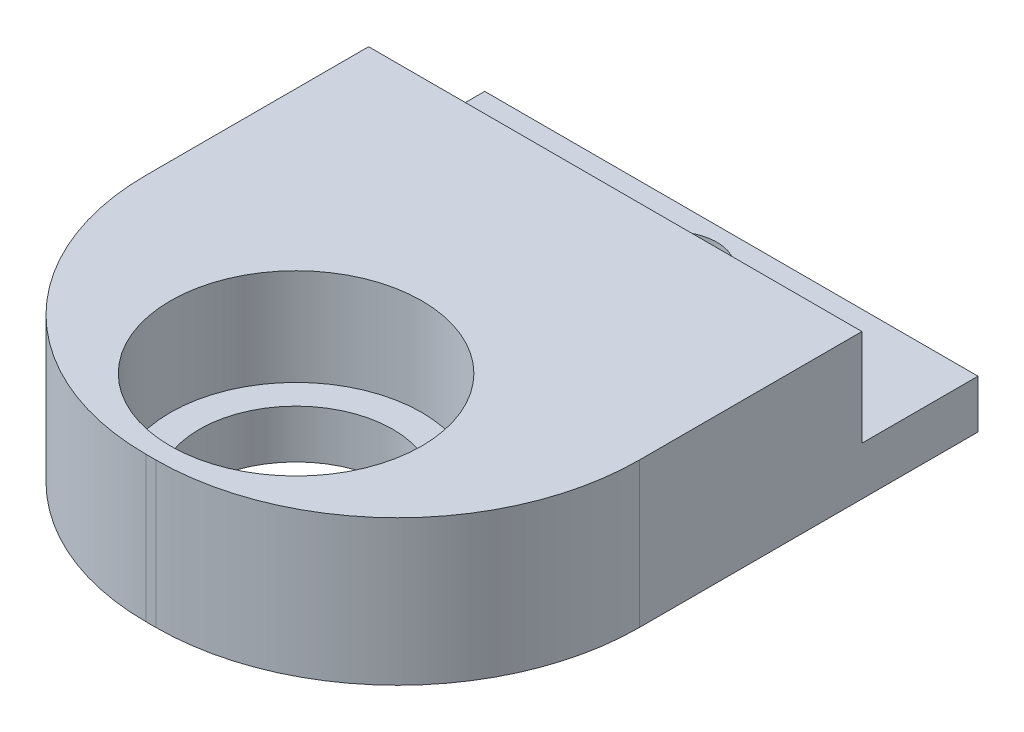
ISO-10303-21;
HEADER;
FILE_DESCRIPTION(('STEP AP214'),'2;1');
FILE_NAME('part.step','',(''),(''),'','','');
FILE_SCHEMA(('AUTOMOTIVE_DESIGN { 1 0 10303 214 1 1 1 1 }'));
ENDSEC;
DATA;
#1=APPLICATION_CONTEXT('core data for automotive mechanical design processes');
#2=APPLICATION_PROTOCOL_DEFINITION('international standard','automotive_design',2000,#1);
#3=PRODUCT_CONTEXT('',#1,'mechanical');
#4=PRODUCT('Part','Part','',(#3));
#5=PRODUCT_RELATED_PRODUCT_CATEGORY('part','',(#4));
#6=PRODUCT_DEFINITION_FORMATION('','',#4);
#7=PRODUCT_DEFINITION_CONTEXT('part definition',#1,'design');
#8=PRODUCT_DEFINITION('design','',#6,#7);
#9=PRODUCT_DEFINITION_SHAPE('','',#8);
#10=(LENGTH_UNIT() NAMED_UNIT(*) SI_UNIT(.MILLI.,.METRE.));
#11=(NAMED_UNIT(*) PLANE_ANGLE_UNIT() SI_UNIT($,.RADIAN.));
#12=(NAMED_UNIT(*) SI_UNIT($,.STERADIAN.) SOLID_ANGLE_UNIT());
#13=UNCERTAINTY_MEASURE_WITH_UNIT(LENGTH_MEASURE(1.E-05),#10,'distance_accuracy_value','');
#14=(GEOMETRIC_REPRESENTATION_CONTEXT(3) GLOBAL_UNCERTAINTY_ASSIGNED_CONTEXT((#13)) GLOBAL_UNIT_ASSIGNED_CONTEXT((#10,
#11,#12)) REPRESENTATION_CONTEXT('',''));
#15=CARTESIAN_POINT('',(0.,0.,0.));
#16=DIRECTION('',(0.,0.,1.));
#17=DIRECTION('',(1.,0.,0.));
#18=AXIS2_PLACEMENT_3D('',#15,#16,#17);
#19=CARTESIAN_POINT('',(0.,5.,0.));
#20=DIRECTION('',(0.,1.,0.));
#21=DIRECTION('',(0.,0.,1.));
#22=AXIS2_PLACEMENT_3D('',#19,#20,#21);
#23=PLANE('',#22);
#24=CARTESIAN_POINT('',(0.,5.,-24.));
#25=DIRECTION('',(0.,1.,0.));
#26=DIRECTION('',(0.,0.,1.));
#27=AXIS2_PLACEMENT_3D('',#24,#25,#26);
#28=CIRCLE('',#27,4.5);
#29=CARTESIAN_POINT('',(0.,5.,-19.5));
#30=VERTEX_POINT('',#29);
#31=EDGE_CURVE('E160',#30,#30,#28,.T.);
#32=ORIENTED_EDGE('',*,*,#31,.F.);
#33=EDGE_LOOP('',(#32));
#34=FACE_BOUND('',#33,.T.);
#35=DIRECTION('',(0.,0.,1.));
#36=VECTOR('',#35,1.);
#37=CARTESIAN_POINT('',(-25.5,5.,30.));
#38=LINE('',#37,#36);
#39=CARTESIAN_POINT('',(-25.5,5.,-30.));
#40=VERTEX_POINT('',#39);
#41=CARTESIAN_POINT('',(-25.5,5.,-18.));
#42=VERTEX_POINT('',#41);
#43=EDGE_CURVE('E168',#40,#42,#38,.T.);
#44=ORIENTED_EDGE('',*,*,#43,.T.);
#45=DIRECTION('',(1.,0.,0.));
#46=VECTOR('',#45,1.);
#47=CARTESIAN_POINT('',(0.,5.,-18.));
#48=LINE('',#47,#46);
#49=CARTESIAN_POINT('',(25.5,5.,-18.));
#50=VERTEX_POINT('',#49);
#51=EDGE_CURVE('E128',#42,#50,#48,.T.);
#52=ORIENTED_EDGE('',*,*,#51,.T.);
#53=DIRECTION('',(0.,0.,-1.));
#54=VECTOR('',#53,1.);
#55=CARTESIAN_POINT('',(25.5,5.,30.));
#56=LINE('',#55,#54);
#57=CARTESIAN_POINT('',(25.5,5.,-30.));
#58=VERTEX_POINT('',#57);
#59=EDGE_CURVE('E171',#50,#58,#56,.T.);
#60=ORIENTED_EDGE('',*,*,#59,.T.);
#61=DIRECTION('',(-1.,0.,0.));
#62=VECTOR('',#61,1.);
#63=CARTESIAN_POINT('',(25.5,5.,-30.));
#64=LINE('',#63,#62);
#65=EDGE_CURVE('E175',#58,#40,#64,.T.);
#66=ORIENTED_EDGE('',*,*,#65,.T.);
#67=EDGE_LOOP('',(#44,#52,#60,#66));
#68=FACE_BOUND('',#67,.T.);
#69=ADVANCED_FACE('F49',(#34,#68),#23,.T.);
#70=CARTESIAN_POINT('',(0.,5.,15.));
#71=DIRECTION('',(0.,1.,0.));
#72=DIRECTION('',(0.,0.,1.));
#73=AXIS2_PLACEMENT_3D('',#70,#71,#72);
#74=CIRCLE('',#73,10.);
#75=CARTESIAN_POINT('',(0.,5.,25.));
#76=VERTEX_POINT('',#75);
#77=EDGE_CURVE('E152',#76,#76,#74,.T.);
#78=ORIENTED_EDGE('',*,*,#77,.F.);
#79=EDGE_LOOP('',(#78));
#80=FACE_BOUND('',#79,.T.);
#81=CARTESIAN_POINT('',(0.,5.,15.));
#82=DIRECTION('',(0.,1.,0.));
#83=DIRECTION('',(0.,0.,1.));
#84=AXIS2_PLACEMENT_3D('',#81,#82,#83);
#85=CIRCLE('',#84,13.);
#86=CARTESIAN_POINT('',(0.,5.,28.));
#87=VERTEX_POINT('',#86);
#88=EDGE_CURVE('E288',#87,#87,#85,.T.);
#89=ORIENTED_EDGE('',*,*,#88,.T.);
#90=EDGE_LOOP('',(#89));
#91=FACE_BOUND('',#90,.T.);
#92=ADVANCED_FACE('F241',(#80,#91),#23,.T.);
#93=CARTESIAN_POINT('',(0.,0.,0.));
#94=DIRECTION('',(0.,1.,0.));
#95=DIRECTION('',(0.,0.,1.));
#96=AXIS2_PLACEMENT_3D('',#93,#94,#95);
#97=PLANE('',#96);
#98=DIRECTION('',(0.,0.,-1.));
#99=VECTOR('',#98,1.);
#100=CARTESIAN_POINT('',(25.5,0.,30.));
#101=LINE('',#100,#99);
#102=CARTESIAN_POINT('',(25.5,0.,5.));
#103=VERTEX_POINT('',#102);
#104=CARTESIAN_POINT('',(25.5,0.,-30.));
#105=VERTEX_POINT('',#104);
#106=EDGE_CURVE('E184',#103,#105,#101,.T.);
#107=ORIENTED_EDGE('',*,*,#106,.F.);
#108=CARTESIAN_POINT('',(0.5,0.,5.));
#109=DIRECTION('',(0.,1.,0.));
#110=DIRECTION('',(0.,0.,1.));
#111=AXIS2_PLACEMENT_3D('',#108,#109,#110);
#112=CIRCLE('',#111,25.);
#113=CARTESIAN_POINT('',(0.500000000000004,0.,30.));
#114=VERTEX_POINT('',#113);
#115=EDGE_CURVE('E202',#103,#114,#112,.F.);
#116=ORIENTED_EDGE('',*,*,#115,.T.);
#117=DIRECTION('',(1.,0.,0.));
#118=VECTOR('',#117,1.);
#119=CARTESIAN_POINT('',(25.5,0.,30.));
#120=LINE('',#119,#118);
#121=CARTESIAN_POINT('',(-0.49999999999999,0.,30.));
#122=VERTEX_POINT('',#121);
#123=EDGE_CURVE('E180',#122,#114,#120,.T.);
#124=ORIENTED_EDGE('',*,*,#123,.F.);
#125=CARTESIAN_POINT('',(-0.499999999999994,0.,5.));
#126=DIRECTION('',(0.,1.,0.));
#127=DIRECTION('',(0.,0.,1.));
#128=AXIS2_PLACEMENT_3D('',#125,#126,#127);
#129=CIRCLE('',#128,25.);
#130=CARTESIAN_POINT('',(-25.5,0.,5.));
#131=VERTEX_POINT('',#130);
#132=EDGE_CURVE('E199',#122,#131,#129,.F.);
#133=ORIENTED_EDGE('',*,*,#132,.T.);
#134=DIRECTION('',(0.,0.,1.));
#135=VECTOR('',#134,1.);
#136=CARTESIAN_POINT('',(-25.5,0.,30.));
#137=LINE('',#136,#135);
#138=CARTESIAN_POINT('',(-25.5,0.,-30.));
#139=VERTEX_POINT('',#138);
#140=EDGE_CURVE('E164',#139,#131,#137,.T.);
#141=ORIENTED_EDGE('',*,*,#140,.F.);
#142=DIRECTION('',(-1.,0.,0.));
#143=VECTOR('',#142,1.);
#144=CARTESIAN_POINT('',(25.5,0.,-30.));
#145=LINE('',#144,#143);
#146=EDGE_CURVE('E172',#105,#139,#145,.T.);
#147=ORIENTED_EDGE('',*,*,#146,.F.);
#148=EDGE_LOOP('',(#107,#116,#124,#133,#141,#147));
#149=FACE_BOUND('',#148,.T.);
#150=CARTESIAN_POINT('',(0.,0.,-24.));
#151=DIRECTION('',(0.,1.,0.));
#152=DIRECTION('',(0.,0.,1.));
#153=AXIS2_PLACEMENT_3D('',#150,#151,#152);
#154=CIRCLE('',#153,4.5);
#155=CARTESIAN_POINT('',(0.,0.,-19.5));
#156=VERTEX_POINT('',#155);
#157=EDGE_CURVE('E156',#156,#156,#154,.T.);
#158=ORIENTED_EDGE('',*,*,#157,.T.);
#159=EDGE_LOOP('',(#158));
#160=FACE_BOUND('',#159,.T.);
#161=CARTESIAN_POINT('',(0.,0.,15.));
#162=DIRECTION('',(0.,1.,0.));
#163=DIRECTION('',(0.,0.,1.));
#164=AXIS2_PLACEMENT_3D('',#161,#162,#163);
#165=CIRCLE('',#164,10.);
#166=CARTESIAN_POINT('',(0.,0.,25.));
#167=VERTEX_POINT('',#166);
#168=EDGE_CURVE('E150',#167,#167,#165,.T.);
#169=ORIENTED_EDGE('',*,*,#168,.T.);
#170=EDGE_LOOP('',(#169));
#171=FACE_BOUND('',#170,.T.);
#172=ADVANCED_FACE('F226',(#149,#160,#171),#97,.F.);
#173=CARTESIAN_POINT('',(-25.5,5.,30.));
#174=DIRECTION('',(1.,0.,0.));
#175=DIRECTION('',(0.,0.,-1.));
#176=AXIS2_PLACEMENT_3D('',#173,#174,#175);
#177=PLANE('',#176);
#178=ORIENTED_EDGE('',*,*,#140,.T.);
#179=DIRECTION('',(0.,-1.,0.));
#180=VECTOR('',#179,1.);
#181=CARTESIAN_POINT('',(-25.5,5.,5.));
#182=LINE('',#181,#180);
#183=CARTESIAN_POINT('',(-25.5,15.,5.));
#184=VERTEX_POINT('',#183);
#185=EDGE_CURVE('E11',#131,#184,#182,.F.);
#186=ORIENTED_EDGE('',*,*,#185,.T.);
#187=DIRECTION('',(0.,0.,-1.));
#188=VECTOR('',#187,1.);
#189=CARTESIAN_POINT('',(-25.5,15.,0.));
#190=LINE('',#189,#188);
#191=CARTESIAN_POINT('',(-25.5,15.,-18.));
#192=VERTEX_POINT('',#191);
#193=EDGE_CURVE('E112',#184,#192,#190,.T.);
#194=ORIENTED_EDGE('',*,*,#193,.T.);
#195=DIRECTION('',(0.,-1.,0.));
#196=VECTOR('',#195,1.);
#197=CARTESIAN_POINT('',(-25.5,15.,-18.));
#198=LINE('',#197,#196);
#199=EDGE_CURVE('E116',#192,#42,#198,.T.);
#200=ORIENTED_EDGE('',*,*,#199,.T.);
#201=ORIENTED_EDGE('',*,*,#43,.F.);
#202=DIRECTION('',(0.,-1.,0.));
#203=VECTOR('',#202,1.);
#204=CARTESIAN_POINT('',(-25.5,5.,-30.));
#205=LINE('',#204,#203);
#206=EDGE_CURVE('E178',#40,#139,#205,.T.);
#207=ORIENTED_EDGE('',*,*,#206,.T.);
#208=EDGE_LOOP('',(#178,#186,#194,#200,#201,#207));
#209=FACE_BOUND('',#208,.T.);
#210=ADVANCED_FACE('F114',(#209),#177,.F.);
#211=CARTESIAN_POINT('',(25.5,5.,30.));
#212=DIRECTION('',(0.,0.,-1.));
#213=DIRECTION('',(-1.,0.,0.));
#214=AXIS2_PLACEMENT_3D('',#211,#212,#213);
#215=PLANE('',#214);
#216=ORIENTED_EDGE('',*,*,#123,.T.);
#217=DIRECTION('',(0.,-1.,0.));
#218=VECTOR('',#217,1.);
#219=CARTESIAN_POINT('',(0.500000000000004,5.,30.));
#220=LINE('',#219,#218);
#221=CARTESIAN_POINT('',(0.500000000000004,15.,30.));
#222=VERTEX_POINT('',#221);
#223=EDGE_CURVE('E209',#114,#222,#220,.F.);
#224=ORIENTED_EDGE('',*,*,#223,.T.);
#225=DIRECTION('',(-1.,0.,0.));
#226=VECTOR('',#225,1.);
#227=CARTESIAN_POINT('',(0.,15.,30.));
#228=LINE('',#227,#226);
#229=CARTESIAN_POINT('',(-0.49999999999999,15.,30.));
#230=VERTEX_POINT('',#229);
#231=EDGE_CURVE('E121',#222,#230,#228,.T.);
#232=ORIENTED_EDGE('',*,*,#231,.T.);
#233=DIRECTION('',(0.,-1.,0.));
#234=VECTOR('',#233,1.);
#235=CARTESIAN_POINT('',(-0.49999999999999,5.,30.));
#236=LINE('',#235,#234);
#237=EDGE_CURVE('E205',#230,#122,#236,.T.);
#238=ORIENTED_EDGE('',*,*,#237,.T.);
#239=EDGE_LOOP('',(#216,#224,#232,#238));
#240=FACE_BOUND('',#239,.T.);
#241=ADVANCED_FACE('F230',(#240),#215,.F.);
#242=CARTESIAN_POINT('',(25.5,5.,30.));
#243=DIRECTION('',(-1.,0.,0.));
#244=DIRECTION('',(0.,0.,1.));
#245=AXIS2_PLACEMENT_3D('',#242,#243,#244);
#246=PLANE('',#245);
#247=DIRECTION('',(0.,0.,1.));
#248=VECTOR('',#247,1.);
#249=CARTESIAN_POINT('',(25.5,15.,0.));
#250=LINE('',#249,#248);
#251=CARTESIAN_POINT('',(25.5,15.,-18.));
#252=VERTEX_POINT('',#251);
#253=CARTESIAN_POINT('',(25.5,15.,5.));
#254=VERTEX_POINT('',#253);
#255=EDGE_CURVE('E132',#252,#254,#250,.T.);
#256=ORIENTED_EDGE('',*,*,#255,.T.);
#257=DIRECTION('',(0.,-1.,0.));
#258=VECTOR('',#257,1.);
#259=CARTESIAN_POINT('',(25.5,5.,5.));
#260=LINE('',#259,#258);
#261=EDGE_CURVE('E195',#254,#103,#260,.T.);
#262=ORIENTED_EDGE('',*,*,#261,.T.);
#263=ORIENTED_EDGE('',*,*,#106,.T.);
#264=DIRECTION('',(0.,-1.,0.));
#265=VECTOR('',#264,1.);
#266=CARTESIAN_POINT('',(25.5,5.,-30.));
#267=LINE('',#266,#265);
#268=EDGE_CURVE('E191',#58,#105,#267,.T.);
#269=ORIENTED_EDGE('',*,*,#268,.F.);
#270=ORIENTED_EDGE('',*,*,#59,.F.);
#271=DIRECTION('',(0.,-1.,0.));
#272=VECTOR('',#271,1.);
#273=CARTESIAN_POINT('',(25.5,15.,-18.));
#274=LINE('',#273,#272);
#275=EDGE_CURVE('E131',#252,#50,#274,.T.);
#276=ORIENTED_EDGE('',*,*,#275,.F.);
#277=EDGE_LOOP('',(#256,#262,#263,#269,#270,#276));
#278=FACE_BOUND('',#277,.T.);
#279=ADVANCED_FACE('F220',(#278),#246,.F.);
#280=CARTESIAN_POINT('',(25.5,5.,-30.));
#281=DIRECTION('',(0.,0.,1.));
#282=DIRECTION('',(1.,0.,0.));
#283=AXIS2_PLACEMENT_3D('',#280,#281,#282);
#284=PLANE('',#283);
#285=ORIENTED_EDGE('',*,*,#146,.T.);
#286=ORIENTED_EDGE('',*,*,#206,.F.);
#287=ORIENTED_EDGE('',*,*,#65,.F.);
#288=ORIENTED_EDGE('',*,*,#268,.T.);
#289=EDGE_LOOP('',(#285,#286,#287,#288));
#290=FACE_BOUND('',#289,.T.);
#291=ADVANCED_FACE('F237',(#290),#284,.F.);
#292=CARTESIAN_POINT('',(0.,5.,-24.));
#293=DIRECTION('',(0.,-1.,0.));
#294=DIRECTION('',(0.,0.,-1.));
#295=AXIS2_PLACEMENT_3D('',#292,#293,#294);
#296=CYLINDRICAL_SURFACE('',#295,4.5);
#297=ORIENTED_EDGE('',*,*,#31,.T.);
#298=EDGE_LOOP('',(#297));
#299=FACE_BOUND('',#298,.T.);
#300=ORIENTED_EDGE('',*,*,#157,.F.);
#301=EDGE_LOOP('',(#300));
#302=FACE_BOUND('',#301,.T.);
#303=ADVANCED_FACE('F250',(#299,#302),#296,.F.);
#304=CARTESIAN_POINT('',(0.,5.,15.));
#305=DIRECTION('',(0.,-1.,0.));
#306=DIRECTION('',(0.,0.,-1.));
#307=AXIS2_PLACEMENT_3D('',#304,#305,#306);
#308=CYLINDRICAL_SURFACE('',#307,10.);
#309=ORIENTED_EDGE('',*,*,#77,.T.);
#310=EDGE_LOOP('',(#309));
#311=FACE_BOUND('',#310,.T.);
#312=ORIENTED_EDGE('',*,*,#168,.F.);
#313=EDGE_LOOP('',(#312));
#314=FACE_BOUND('',#313,.T.);
#315=ADVANCED_FACE('F275',(#311,#314),#308,.F.);
#316=CARTESIAN_POINT('',(0.,15.,0.));
#317=DIRECTION('',(0.,-1.,0.));
#318=DIRECTION('',(0.,0.,-1.));
#319=AXIS2_PLACEMENT_3D('',#316,#317,#318);
#320=PLANE('',#319);
#321=ORIENTED_EDGE('',*,*,#231,.F.);
#322=CARTESIAN_POINT('',(0.5,15.,5.));
#323=DIRECTION('',(0.,-1.,0.));
#324=DIRECTION('',(0.,0.,-1.));
#325=AXIS2_PLACEMENT_3D('',#322,#323,#324);
#326=CIRCLE('',#325,25.);
#327=EDGE_CURVE('E58',#222,#254,#326,.F.);
#328=ORIENTED_EDGE('',*,*,#327,.T.);
#329=ORIENTED_EDGE('',*,*,#255,.F.);
#330=DIRECTION('',(1.,0.,0.));
#331=VECTOR('',#330,1.);
#332=CARTESIAN_POINT('',(0.,15.,-18.));
#333=LINE('',#332,#331);
#334=EDGE_CURVE('E120',#192,#252,#333,.T.);
#335=ORIENTED_EDGE('',*,*,#334,.F.);
#336=ORIENTED_EDGE('',*,*,#193,.F.);
#337=CARTESIAN_POINT('',(-0.499999999999994,15.,5.));
#338=DIRECTION('',(0.,-1.,0.));
#339=DIRECTION('',(0.,0.,-1.));
#340=AXIS2_PLACEMENT_3D('',#337,#338,#339);
#341=CIRCLE('',#340,25.);
#342=EDGE_CURVE('E70',#184,#230,#341,.F.);
#343=ORIENTED_EDGE('',*,*,#342,.T.);
#344=EDGE_LOOP('',(#321,#328,#329,#335,#336,#343));
#345=FACE_BOUND('',#344,.T.);
#346=CARTESIAN_POINT('',(0.,15.,15.));
#347=DIRECTION('',(0.,1.,0.));
#348=DIRECTION('',(0.,0.,1.));
#349=AXIS2_PLACEMENT_3D('',#346,#347,#348);
#350=CIRCLE('',#349,13.);
#351=CARTESIAN_POINT('',(0.,15.,28.));
#352=VERTEX_POINT('',#351);
#353=EDGE_CURVE('E148',#352,#352,#350,.T.);
#354=ORIENTED_EDGE('',*,*,#353,.F.);
#355=EDGE_LOOP('',(#354));
#356=FACE_BOUND('',#355,.T.);
#357=ADVANCED_FACE('F134',(#345,#356),#320,.F.);
#358=CARTESIAN_POINT('',(0.,15.,-18.));
#359=DIRECTION('',(0.,0.,-1.));
#360=DIRECTION('',(-1.,0.,0.));
#361=AXIS2_PLACEMENT_3D('',#358,#359,#360);
#362=PLANE('',#361);
#363=ORIENTED_EDGE('',*,*,#51,.F.);
#364=ORIENTED_EDGE('',*,*,#199,.F.);
#365=ORIENTED_EDGE('',*,*,#334,.T.);
#366=ORIENTED_EDGE('',*,*,#275,.T.);
#367=EDGE_LOOP('',(#363,#364,#365,#366));
#368=FACE_BOUND('',#367,.T.);
#369=ADVANCED_FACE('F125',(#368),#362,.T.);
#370=CARTESIAN_POINT('',(0.,15.,15.));
#371=DIRECTION('',(0.,-1.,0.));
#372=DIRECTION('',(0.,0.,-1.));
#373=AXIS2_PLACEMENT_3D('',#370,#371,#372);
#374=CYLINDRICAL_SURFACE('',#373,13.);
#375=ORIENTED_EDGE('',*,*,#353,.T.);
#376=EDGE_LOOP('',(#375));
#377=FACE_BOUND('',#376,.T.);
#378=ORIENTED_EDGE('',*,*,#88,.F.);
#379=EDGE_LOOP('',(#378));
#380=FACE_BOUND('',#379,.T.);
#381=ADVANCED_FACE('F262',(#377,#380),#374,.F.);
#382=CARTESIAN_POINT('',(0.5,5.,5.));
#383=DIRECTION('',(0.,-1.,0.));
#384=DIRECTION('',(0.,0.,-1.));
#385=AXIS2_PLACEMENT_3D('',#382,#383,#384);
#386=CYLINDRICAL_SURFACE('',#385,25.);
#387=ORIENTED_EDGE('',*,*,#327,.F.);
#388=ORIENTED_EDGE('',*,*,#223,.F.);
#389=ORIENTED_EDGE('',*,*,#115,.F.);
#390=ORIENTED_EDGE('',*,*,#261,.F.);
#391=EDGE_LOOP('',(#387,#388,#389,#390));
#392=FACE_BOUND('',#391,.T.);
#393=ADVANCED_FACE('F223',(#392),#386,.T.);
#394=CARTESIAN_POINT('',(-0.499999999999994,5.,5.));
#395=DIRECTION('',(0.,-1.,0.));
#396=DIRECTION('',(0.,0.,-1.));
#397=AXIS2_PLACEMENT_3D('',#394,#395,#396);
#398=CYLINDRICAL_SURFACE('',#397,25.);
#399=ORIENTED_EDGE('',*,*,#342,.F.);
#400=ORIENTED_EDGE('',*,*,#185,.F.);
#401=ORIENTED_EDGE('',*,*,#132,.F.);
#402=ORIENTED_EDGE('',*,*,#237,.F.);
#403=EDGE_LOOP('',(#399,#400,#401,#402));
#404=FACE_BOUND('',#403,.T.);
#405=ADVANCED_FACE('F51',(#404),#398,.T.);
#406=CLOSED_SHELL('',(#69,#92,#172,#210,#241,#279,#291,#303,#315,#357,#369,#381,#393,#405));
#407=MANIFOLD_SOLID_BREP('B2',#406);
#408=ADVANCED_BREP_SHAPE_REPRESENTATION('',(#18,#407),#14);
#409=SHAPE_DEFINITION_REPRESENTATION(#9,#408);
ENDSEC;
END-ISO-10303-21;
